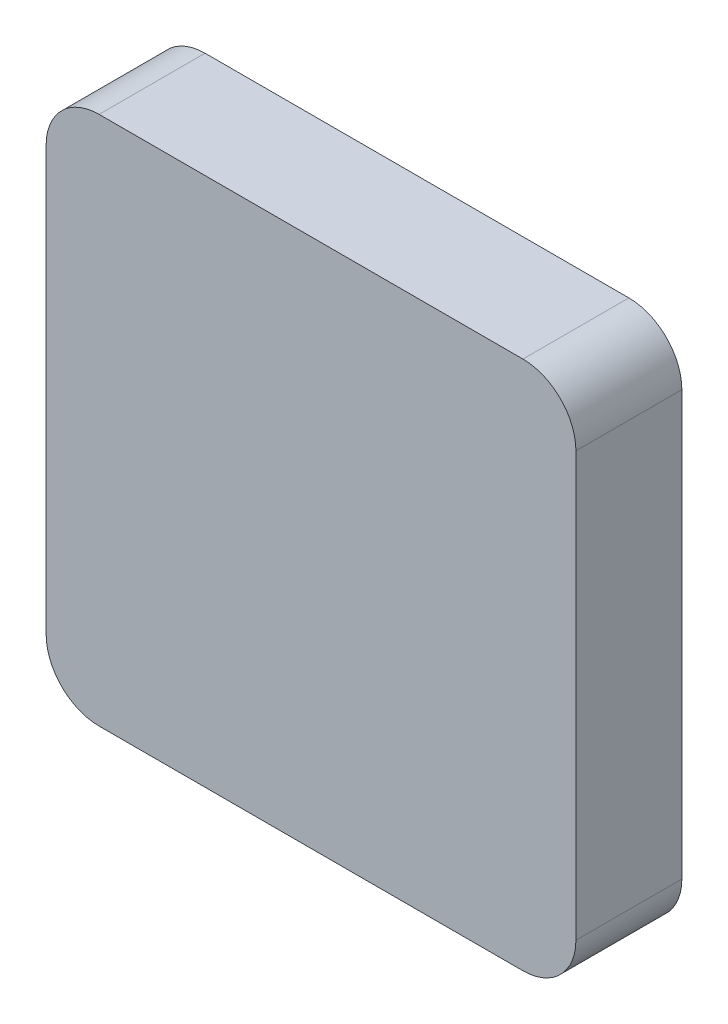
ISO-10303-21;
HEADER;
FILE_DESCRIPTION(('STEP AP214'),'2;1');
FILE_NAME('part.step','',(''),(''),'','','');
FILE_SCHEMA(('AUTOMOTIVE_DESIGN { 1 0 10303 214 1 1 1 1 }'));
ENDSEC;
DATA;
#1=APPLICATION_CONTEXT('core data for automotive mechanical design processes');
#2=APPLICATION_PROTOCOL_DEFINITION('international standard','automotive_design',2000,#1);
#3=PRODUCT_CONTEXT('',#1,'mechanical');
#4=PRODUCT('Part','Part','',(#3));
#5=PRODUCT_RELATED_PRODUCT_CATEGORY('part','',(#4));
#6=PRODUCT_DEFINITION_FORMATION('','',#4);
#7=PRODUCT_DEFINITION_CONTEXT('part definition',#1,'design');
#8=PRODUCT_DEFINITION('design','',#6,#7);
#9=PRODUCT_DEFINITION_SHAPE('','',#8);
#10=(LENGTH_UNIT() NAMED_UNIT(*) SI_UNIT(.MILLI.,.METRE.));
#11=(NAMED_UNIT(*) PLANE_ANGLE_UNIT() SI_UNIT($,.RADIAN.));
#12=(NAMED_UNIT(*) SI_UNIT($,.STERADIAN.) SOLID_ANGLE_UNIT());
#13=UNCERTAINTY_MEASURE_WITH_UNIT(LENGTH_MEASURE(1.E-05),#10,'distance_accuracy_value','');
#14=(GEOMETRIC_REPRESENTATION_CONTEXT(3) GLOBAL_UNCERTAINTY_ASSIGNED_CONTEXT((#13)) GLOBAL_UNIT_ASSIGNED_CONTEXT((#10,
#11,#12)) REPRESENTATION_CONTEXT('',''));
#15=CARTESIAN_POINT('',(0.,0.,0.));
#16=DIRECTION('',(0.,0.,1.));
#17=DIRECTION('',(1.,0.,0.));
#18=AXIS2_PLACEMENT_3D('',#15,#16,#17);
#19=CARTESIAN_POINT('',(25.,-25.,10.));
#20=DIRECTION('',(-1.,0.,0.));
#21=DIRECTION('',(0.,0.,1.));
#22=AXIS2_PLACEMENT_3D('',#19,#20,#21);
#23=PLANE('',#22);
#24=DIRECTION('',(0.,1.,0.));
#25=VECTOR('',#24,1.);
#26=CARTESIAN_POINT('',(25.,-25.,10.));
#27=LINE('',#26,#25);
#28=CARTESIAN_POINT('',(25.,-20.,10.));
#29=VERTEX_POINT('',#28);
#30=CARTESIAN_POINT('',(25.,20.,10.));
#31=VERTEX_POINT('',#30);
#32=EDGE_CURVE('E124',#29,#31,#27,.T.);
#33=ORIENTED_EDGE('',*,*,#32,.F.);
#34=DIRECTION('',(0.,0.,-1.));
#35=VECTOR('',#34,1.);
#36=CARTESIAN_POINT('',(25.,-20.,10.));
#37=LINE('',#36,#35);
#38=CARTESIAN_POINT('',(25.,-20.,0.));
#39=VERTEX_POINT('',#38);
#40=EDGE_CURVE('E109',#29,#39,#37,.T.);
#41=ORIENTED_EDGE('',*,*,#40,.T.);
#42=DIRECTION('',(0.,1.,0.));
#43=VECTOR('',#42,1.);
#44=CARTESIAN_POINT('',(25.,-25.,0.));
#45=LINE('',#44,#43);
#46=CARTESIAN_POINT('',(25.,20.,0.));
#47=VERTEX_POINT('',#46);
#48=EDGE_CURVE('E121',#39,#47,#45,.T.);
#49=ORIENTED_EDGE('',*,*,#48,.T.);
#50=DIRECTION('',(0.,0.,-1.));
#51=VECTOR('',#50,1.);
#52=CARTESIAN_POINT('',(25.,20.,10.));
#53=LINE('',#52,#51);
#54=EDGE_CURVE('E126',#47,#31,#53,.F.);
#55=ORIENTED_EDGE('',*,*,#54,.T.);
#56=EDGE_LOOP('',(#33,#41,#49,#55));
#57=FACE_BOUND('',#56,.T.);
#58=ADVANCED_FACE('F39',(#57),#23,.F.);
#59=CARTESIAN_POINT('',(-25.,25.,10.));
#60=DIRECTION('',(0.,-1.,0.));
#61=DIRECTION('',(0.,0.,-1.));
#62=AXIS2_PLACEMENT_3D('',#59,#60,#61);
#63=PLANE('',#62);
#64=DIRECTION('',(-1.,0.,0.));
#65=VECTOR('',#64,1.);
#66=CARTESIAN_POINT('',(-25.,25.,0.));
#67=LINE('',#66,#65);
#68=CARTESIAN_POINT('',(20.,25.,0.));
#69=VERTEX_POINT('',#68);
#70=CARTESIAN_POINT('',(-20.,25.,0.));
#71=VERTEX_POINT('',#70);
#72=EDGE_CURVE('E130',#69,#71,#67,.T.);
#73=ORIENTED_EDGE('',*,*,#72,.T.);
#74=DIRECTION('',(0.,0.,-1.));
#75=VECTOR('',#74,1.);
#76=CARTESIAN_POINT('',(-20.,25.,10.));
#77=LINE('',#76,#75);
#78=CARTESIAN_POINT('',(-20.,25.,10.));
#79=VERTEX_POINT('',#78);
#80=EDGE_CURVE('E11',#71,#79,#77,.F.);
#81=ORIENTED_EDGE('',*,*,#80,.T.);
#82=DIRECTION('',(-1.,0.,0.));
#83=VECTOR('',#82,1.);
#84=CARTESIAN_POINT('',(-25.,25.,10.));
#85=LINE('',#84,#83);
#86=CARTESIAN_POINT('',(20.,25.,10.));
#87=VERTEX_POINT('',#86);
#88=EDGE_CURVE('E166',#87,#79,#85,.T.);
#89=ORIENTED_EDGE('',*,*,#88,.F.);
#90=DIRECTION('',(0.,0.,-1.));
#91=VECTOR('',#90,1.);
#92=CARTESIAN_POINT('',(20.,25.,10.));
#93=LINE('',#92,#91);
#94=EDGE_CURVE('E47',#87,#69,#93,.T.);
#95=ORIENTED_EDGE('',*,*,#94,.T.);
#96=EDGE_LOOP('',(#73,#81,#89,#95));
#97=FACE_BOUND('',#96,.T.);
#98=ADVANCED_FACE('F164',(#97),#63,.F.);
#99=CARTESIAN_POINT('',(-25.,-25.,10.));
#100=DIRECTION('',(1.,0.,0.));
#101=DIRECTION('',(0.,0.,-1.));
#102=AXIS2_PLACEMENT_3D('',#99,#100,#101);
#103=PLANE('',#102);
#104=DIRECTION('',(0.,-1.,0.));
#105=VECTOR('',#104,1.);
#106=CARTESIAN_POINT('',(-25.,-25.,0.));
#107=LINE('',#106,#105);
#108=CARTESIAN_POINT('',(-25.,20.,0.));
#109=VERTEX_POINT('',#108);
#110=CARTESIAN_POINT('',(-25.,-20.,0.));
#111=VERTEX_POINT('',#110);
#112=EDGE_CURVE('E133',#109,#111,#107,.T.);
#113=ORIENTED_EDGE('',*,*,#112,.T.);
#114=DIRECTION('',(0.,0.,-1.));
#115=VECTOR('',#114,1.);
#116=CARTESIAN_POINT('',(-25.,-20.,10.));
#117=LINE('',#116,#115);
#118=CARTESIAN_POINT('',(-25.,-20.,10.));
#119=VERTEX_POINT('',#118);
#120=EDGE_CURVE('E54',#111,#119,#117,.F.);
#121=ORIENTED_EDGE('',*,*,#120,.T.);
#122=DIRECTION('',(0.,-1.,0.));
#123=VECTOR('',#122,1.);
#124=CARTESIAN_POINT('',(-25.,-25.,10.));
#125=LINE('',#124,#123);
#126=CARTESIAN_POINT('',(-25.,20.,10.));
#127=VERTEX_POINT('',#126);
#128=EDGE_CURVE('E174',#127,#119,#125,.T.);
#129=ORIENTED_EDGE('',*,*,#128,.F.);
#130=DIRECTION('',(0.,0.,-1.));
#131=VECTOR('',#130,1.);
#132=CARTESIAN_POINT('',(-25.,20.,10.));
#133=LINE('',#132,#131);
#134=EDGE_CURVE('E157',#127,#109,#133,.T.);
#135=ORIENTED_EDGE('',*,*,#134,.T.);
#136=EDGE_LOOP('',(#113,#121,#129,#135));
#137=FACE_BOUND('',#136,.T.);
#138=ADVANCED_FACE('F173',(#137),#103,.F.);
#139=CARTESIAN_POINT('',(-25.,-25.,10.));
#140=DIRECTION('',(0.,1.,0.));
#141=DIRECTION('',(0.,0.,1.));
#142=AXIS2_PLACEMENT_3D('',#139,#140,#141);
#143=PLANE('',#142);
#144=DIRECTION('',(1.,0.,0.));
#145=VECTOR('',#144,1.);
#146=CARTESIAN_POINT('',(-25.,-25.,0.));
#147=LINE('',#146,#145);
#148=CARTESIAN_POINT('',(-20.,-25.,0.));
#149=VERTEX_POINT('',#148);
#150=CARTESIAN_POINT('',(20.,-25.,0.));
#151=VERTEX_POINT('',#150);
#152=EDGE_CURVE('E140',#149,#151,#147,.T.);
#153=ORIENTED_EDGE('',*,*,#152,.T.);
#154=DIRECTION('',(0.,0.,-1.));
#155=VECTOR('',#154,1.);
#156=CARTESIAN_POINT('',(20.,-25.,10.));
#157=LINE('',#156,#155);
#158=CARTESIAN_POINT('',(20.,-25.,10.));
#159=VERTEX_POINT('',#158);
#160=EDGE_CURVE('E110',#151,#159,#157,.F.);
#161=ORIENTED_EDGE('',*,*,#160,.T.);
#162=DIRECTION('',(1.,0.,0.));
#163=VECTOR('',#162,1.);
#164=CARTESIAN_POINT('',(-25.,-25.,10.));
#165=LINE('',#164,#163);
#166=CARTESIAN_POINT('',(-20.,-25.,10.));
#167=VERTEX_POINT('',#166);
#168=EDGE_CURVE('E136',#167,#159,#165,.T.);
#169=ORIENTED_EDGE('',*,*,#168,.F.);
#170=DIRECTION('',(0.,0.,-1.));
#171=VECTOR('',#170,1.);
#172=CARTESIAN_POINT('',(-20.,-25.,10.));
#173=LINE('',#172,#171);
#174=EDGE_CURVE('E115',#167,#149,#173,.T.);
#175=ORIENTED_EDGE('',*,*,#174,.T.);
#176=EDGE_LOOP('',(#153,#161,#169,#175));
#177=FACE_BOUND('',#176,.T.);
#178=ADVANCED_FACE('F202',(#177),#143,.F.);
#179=CARTESIAN_POINT('',(0.,0.,10.));
#180=DIRECTION('',(0.,0.,-1.));
#181=DIRECTION('',(-1.,0.,0.));
#182=AXIS2_PLACEMENT_3D('',#179,#180,#181);
#183=PLANE('',#182);
#184=ORIENTED_EDGE('',*,*,#168,.T.);
#185=CARTESIAN_POINT('',(20.,-20.,10.));
#186=DIRECTION('',(0.,0.,-1.));
#187=DIRECTION('',(-1.,0.,0.));
#188=AXIS2_PLACEMENT_3D('',#185,#186,#187);
#189=CIRCLE('',#188,5.);
#190=EDGE_CURVE('E155',#159,#29,#189,.F.);
#191=ORIENTED_EDGE('',*,*,#190,.T.);
#192=ORIENTED_EDGE('',*,*,#32,.T.);
#193=CARTESIAN_POINT('',(20.,20.,10.));
#194=DIRECTION('',(0.,0.,-1.));
#195=DIRECTION('',(-1.,0.,0.));
#196=AXIS2_PLACEMENT_3D('',#193,#194,#195);
#197=CIRCLE('',#196,5.);
#198=EDGE_CURVE('E150',#31,#87,#197,.F.);
#199=ORIENTED_EDGE('',*,*,#198,.T.);
#200=ORIENTED_EDGE('',*,*,#88,.T.);
#201=CARTESIAN_POINT('',(-20.,20.,10.));
#202=DIRECTION('',(0.,0.,-1.));
#203=DIRECTION('',(-1.,0.,0.));
#204=AXIS2_PLACEMENT_3D('',#201,#202,#203);
#205=CIRCLE('',#204,5.);
#206=EDGE_CURVE('E61',#79,#127,#205,.F.);
#207=ORIENTED_EDGE('',*,*,#206,.T.);
#208=ORIENTED_EDGE('',*,*,#128,.T.);
#209=CARTESIAN_POINT('',(-20.,-20.,10.));
#210=DIRECTION('',(0.,0.,-1.));
#211=DIRECTION('',(-1.,0.,0.));
#212=AXIS2_PLACEMENT_3D('',#209,#210,#211);
#213=CIRCLE('',#212,5.);
#214=EDGE_CURVE('E153',#119,#167,#213,.F.);
#215=ORIENTED_EDGE('',*,*,#214,.T.);
#216=EDGE_LOOP('',(#184,#191,#192,#199,#200,#207,#208,#215));
#217=FACE_BOUND('',#216,.T.);
#218=ADVANCED_FACE('F179',(#217),#183,.F.);
#219=CARTESIAN_POINT('',(0.,0.,0.));
#220=DIRECTION('',(0.,0.,-1.));
#221=DIRECTION('',(-1.,0.,0.));
#222=AXIS2_PLACEMENT_3D('',#219,#220,#221);
#223=PLANE('',#222);
#224=ORIENTED_EDGE('',*,*,#48,.F.);
#225=CARTESIAN_POINT('',(20.,-20.,0.));
#226=DIRECTION('',(0.,0.,-1.));
#227=DIRECTION('',(-1.,0.,0.));
#228=AXIS2_PLACEMENT_3D('',#225,#226,#227);
#229=CIRCLE('',#228,5.);
#230=EDGE_CURVE('E105',#39,#151,#229,.T.);
#231=ORIENTED_EDGE('',*,*,#230,.T.);
#232=ORIENTED_EDGE('',*,*,#152,.F.);
#233=CARTESIAN_POINT('',(-20.,-20.,0.));
#234=DIRECTION('',(0.,0.,-1.));
#235=DIRECTION('',(-1.,0.,0.));
#236=AXIS2_PLACEMENT_3D('',#233,#234,#235);
#237=CIRCLE('',#236,5.);
#238=EDGE_CURVE('E116',#149,#111,#237,.T.);
#239=ORIENTED_EDGE('',*,*,#238,.T.);
#240=ORIENTED_EDGE('',*,*,#112,.F.);
#241=CARTESIAN_POINT('',(-20.,20.,0.));
#242=DIRECTION('',(0.,0.,-1.));
#243=DIRECTION('',(-1.,0.,0.));
#244=AXIS2_PLACEMENT_3D('',#241,#242,#243);
#245=CIRCLE('',#244,5.);
#246=EDGE_CURVE('E144',#109,#71,#245,.T.);
#247=ORIENTED_EDGE('',*,*,#246,.T.);
#248=ORIENTED_EDGE('',*,*,#72,.F.);
#249=CARTESIAN_POINT('',(20.,20.,0.));
#250=DIRECTION('',(0.,0.,-1.));
#251=DIRECTION('',(-1.,0.,0.));
#252=AXIS2_PLACEMENT_3D('',#249,#250,#251);
#253=CIRCLE('',#252,5.);
#254=EDGE_CURVE('E125',#69,#47,#253,.T.);
#255=ORIENTED_EDGE('',*,*,#254,.T.);
#256=EDGE_LOOP('',(#224,#231,#232,#239,#240,#247,#248,#255));
#257=FACE_BOUND('',#256,.T.);
#258=ADVANCED_FACE('F128',(#257),#223,.T.);
#259=CARTESIAN_POINT('',(20.,-20.,10.));
#260=DIRECTION('',(0.,0.,-1.));
#261=DIRECTION('',(-1.,0.,0.));
#262=AXIS2_PLACEMENT_3D('',#259,#260,#261);
#263=CYLINDRICAL_SURFACE('',#262,5.);
#264=ORIENTED_EDGE('',*,*,#190,.F.);
#265=ORIENTED_EDGE('',*,*,#160,.F.);
#266=ORIENTED_EDGE('',*,*,#230,.F.);
#267=ORIENTED_EDGE('',*,*,#40,.F.);
#268=EDGE_LOOP('',(#264,#265,#266,#267));
#269=FACE_BOUND('',#268,.T.);
#270=ADVANCED_FACE('F108',(#269),#263,.T.);
#271=CARTESIAN_POINT('',(-20.,-20.,10.));
#272=DIRECTION('',(0.,0.,-1.));
#273=DIRECTION('',(-1.,0.,0.));
#274=AXIS2_PLACEMENT_3D('',#271,#272,#273);
#275=CYLINDRICAL_SURFACE('',#274,5.);
#276=ORIENTED_EDGE('',*,*,#214,.F.);
#277=ORIENTED_EDGE('',*,*,#120,.F.);
#278=ORIENTED_EDGE('',*,*,#238,.F.);
#279=ORIENTED_EDGE('',*,*,#174,.F.);
#280=EDGE_LOOP('',(#276,#277,#278,#279));
#281=FACE_BOUND('',#280,.T.);
#282=ADVANCED_FACE('F184',(#281),#275,.T.);
#283=CARTESIAN_POINT('',(-20.,20.,10.));
#284=DIRECTION('',(0.,0.,-1.));
#285=DIRECTION('',(-1.,0.,0.));
#286=AXIS2_PLACEMENT_3D('',#283,#284,#285);
#287=CYLINDRICAL_SURFACE('',#286,5.);
#288=ORIENTED_EDGE('',*,*,#206,.F.);
#289=ORIENTED_EDGE('',*,*,#80,.F.);
#290=ORIENTED_EDGE('',*,*,#246,.F.);
#291=ORIENTED_EDGE('',*,*,#134,.F.);
#292=EDGE_LOOP('',(#288,#289,#290,#291));
#293=FACE_BOUND('',#292,.T.);
#294=ADVANCED_FACE('F172',(#293),#287,.T.);
#295=CARTESIAN_POINT('',(20.,20.,10.));
#296=DIRECTION('',(0.,0.,-1.));
#297=DIRECTION('',(-1.,0.,0.));
#298=AXIS2_PLACEMENT_3D('',#295,#296,#297);
#299=CYLINDRICAL_SURFACE('',#298,5.);
#300=ORIENTED_EDGE('',*,*,#198,.F.);
#301=ORIENTED_EDGE('',*,*,#54,.F.);
#302=ORIENTED_EDGE('',*,*,#254,.F.);
#303=ORIENTED_EDGE('',*,*,#94,.F.);
#304=EDGE_LOOP('',(#300,#301,#302,#303));
#305=FACE_BOUND('',#304,.T.);
#306=ADVANCED_FACE('F41',(#305),#299,.T.);
#307=CLOSED_SHELL('',(#58,#98,#138,#178,#218,#258,#270,#282,#294,#306));
#308=MANIFOLD_SOLID_BREP('B2',#307);
#309=ADVANCED_BREP_SHAPE_REPRESENTATION('',(#18,#308),#14);
#310=SHAPE_DEFINITION_REPRESENTATION(#9,#309);
ENDSEC;
END-ISO-10303-21;
